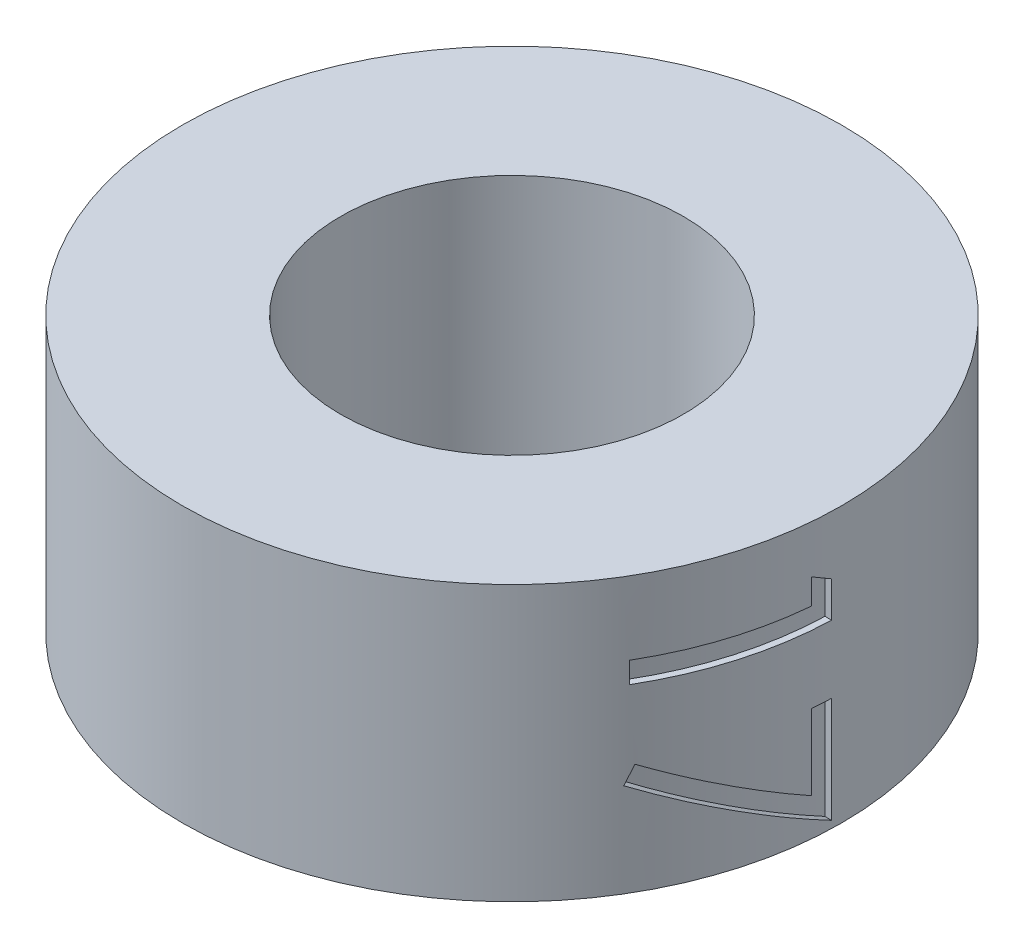
ISO-10303-21;
HEADER;
FILE_DESCRIPTION(('STEP AP214'),'2;1');
FILE_NAME('part.step','',(''),(''),'','','');
FILE_SCHEMA(('AUTOMOTIVE_DESIGN { 1 0 10303 214 1 1 1 1 }'));
ENDSEC;
DATA;
#1=APPLICATION_CONTEXT('core data for automotive mechanical design processes');
#2=APPLICATION_PROTOCOL_DEFINITION('international standard','automotive_design',2000,#1);
#3=PRODUCT_CONTEXT('',#1,'mechanical');
#4=PRODUCT('Part','Part','',(#3));
#5=PRODUCT_RELATED_PRODUCT_CATEGORY('part','',(#4));
#6=PRODUCT_DEFINITION_FORMATION('','',#4);
#7=PRODUCT_DEFINITION_CONTEXT('part definition',#1,'design');
#8=PRODUCT_DEFINITION('design','',#6,#7);
#9=PRODUCT_DEFINITION_SHAPE('','',#8);
#10=(LENGTH_UNIT() NAMED_UNIT(*) SI_UNIT(.MILLI.,.METRE.));
#11=(NAMED_UNIT(*) PLANE_ANGLE_UNIT() SI_UNIT($,.RADIAN.));
#12=(NAMED_UNIT(*) SI_UNIT($,.STERADIAN.) SOLID_ANGLE_UNIT());
#13=UNCERTAINTY_MEASURE_WITH_UNIT(LENGTH_MEASURE(1.E-05),#10,'distance_accuracy_value','');
#14=(GEOMETRIC_REPRESENTATION_CONTEXT(3) GLOBAL_UNCERTAINTY_ASSIGNED_CONTEXT((#13)) GLOBAL_UNIT_ASSIGNED_CONTEXT((#10,
#11,#12)) REPRESENTATION_CONTEXT('',''));
#15=CARTESIAN_POINT('',(0.,0.,0.));
#16=DIRECTION('',(0.,0.,1.));
#17=DIRECTION('',(1.,0.,0.));
#18=AXIS2_PLACEMENT_3D('',#15,#16,#17);
#19=CARTESIAN_POINT('',(0.,10.583333333164,0.));
#20=DIRECTION('',(0.,1.,0.));
#21=DIRECTION('',(0.,0.,1.));
#22=AXIS2_PLACEMENT_3D('',#19,#20,#21);
#23=PLANE('',#22);
#24=CARTESIAN_POINT('',(0.,10.583333333164,0.));
#25=DIRECTION('',(0.,1.,0.));
#26=DIRECTION('',(0.,0.,1.));
#27=AXIS2_PLACEMENT_3D('',#24,#25,#26);
#28=CIRCLE('',#27,12.7);
#29=CARTESIAN_POINT('',(0.,10.583333333164,12.7));
#30=VERTEX_POINT('',#29);
#31=EDGE_CURVE('E13',#30,#30,#28,.T.);
#32=ORIENTED_EDGE('',*,*,#31,.T.);
#33=EDGE_LOOP('',(#32));
#34=FACE_BOUND('',#33,.T.);
#35=CARTESIAN_POINT('',(0.,10.583333333164,0.));
#36=DIRECTION('',(0.,1.,0.));
#37=DIRECTION('',(0.,0.,1.));
#38=AXIS2_PLACEMENT_3D('',#35,#36,#37);
#39=CIRCLE('',#38,6.604);
#40=CARTESIAN_POINT('',(0.,10.583333333164,6.604));
#41=VERTEX_POINT('',#40);
#42=EDGE_CURVE('E464',#41,#41,#39,.T.);
#43=ORIENTED_EDGE('',*,*,#42,.F.);
#44=EDGE_LOOP('',(#43));
#45=FACE_BOUND('',#44,.T.);
#46=ADVANCED_FACE('F85',(#34,#45),#23,.T.);
#47=CARTESIAN_POINT('',(0.,0.,0.));
#48=DIRECTION('',(0.,1.,0.));
#49=DIRECTION('',(0.,0.,1.));
#50=AXIS2_PLACEMENT_3D('',#47,#48,#49);
#51=PLANE('',#50);
#52=CARTESIAN_POINT('',(0.,0.,0.));
#53=DIRECTION('',(0.,1.,0.));
#54=DIRECTION('',(0.,0.,1.));
#55=AXIS2_PLACEMENT_3D('',#52,#53,#54);
#56=CIRCLE('',#55,12.7);
#57=CARTESIAN_POINT('',(0.,0.,12.7));
#58=VERTEX_POINT('',#57);
#59=EDGE_CURVE('E96',#58,#58,#56,.T.);
#60=ORIENTED_EDGE('',*,*,#59,.F.);
#61=EDGE_LOOP('',(#60));
#62=FACE_BOUND('',#61,.T.);
#63=CARTESIAN_POINT('',(0.,0.,0.));
#64=DIRECTION('',(0.,1.,0.));
#65=DIRECTION('',(0.,0.,1.));
#66=AXIS2_PLACEMENT_3D('',#63,#64,#65);
#67=CIRCLE('',#66,6.604);
#68=CARTESIAN_POINT('',(0.,0.,6.604));
#69=VERTEX_POINT('',#68);
#70=EDGE_CURVE('E284',#69,#69,#67,.T.);
#71=ORIENTED_EDGE('',*,*,#70,.T.);
#72=EDGE_LOOP('',(#71));
#73=FACE_BOUND('',#72,.T.);
#74=ADVANCED_FACE('F635',(#62,#73),#51,.F.);
#75=CARTESIAN_POINT('',(0.,10.583333333164,0.));
#76=DIRECTION('',(0.,-1.,0.));
#77=DIRECTION('',(0.,0.,-1.));
#78=AXIS2_PLACEMENT_3D('',#75,#76,#77);
#79=CYLINDRICAL_SURFACE('',#78,12.7);
#80=DIRECTION('',(0.,-1.,0.));
#81=VECTOR('',#80,1.);
#82=CARTESIAN_POINT('',(12.6940492992841,8.3364375463962,0.388731767860738));
#83=LINE('',#82,#81);
#84=CARTESIAN_POINT('',(12.6940492992841,8.3364375463962,0.388731767860738));
#85=VERTEX_POINT('',#84);
#86=CARTESIAN_POINT('',(12.6940492992841,6.95500725793466,0.388731767860738));
#87=VERTEX_POINT('',#86);
#88=EDGE_CURVE('E233',#85,#87,#83,.T.);
#89=ORIENTED_EDGE('',*,*,#88,.T.);
#90=CARTESIAN_POINT('',(0.,6.95500725793466,0.));
#91=DIRECTION('',(0.,-1.,0.));
#92=DIRECTION('',(0.862496721862146,0.,0.506062649063386));
#93=AXIS2_PLACEMENT_3D('',#90,#91,#92);
#94=CIRCLE('',#93,12.7);
#95=CARTESIAN_POINT('',(10.9537083676493,6.95500725793466,6.426995643105));
#96=VERTEX_POINT('',#95);
#97=EDGE_CURVE('E104',#87,#96,#94,.T.);
#98=ORIENTED_EDGE('',*,*,#97,.T.);
#99=DIRECTION('',(0.,1.,0.));
#100=VECTOR('',#99,1.);
#101=CARTESIAN_POINT('',(10.9537083676493,6.95500725793466,6.426995643105));
#102=LINE('',#101,#100);
#103=CARTESIAN_POINT('',(10.9537083676493,7.76910982203722,6.426995643105));
#104=VERTEX_POINT('',#103);
#105=EDGE_CURVE('E776',#96,#104,#102,.T.);
#106=ORIENTED_EDGE('',*,*,#105,.T.);
#107=CARTESIAN_POINT('',(0.,7.76910982203722,0.));
#108=DIRECTION('',(0.,-1.,0.));
#109=DIRECTION('',(0.862496721862146,0.,0.506062649063386));
#110=AXIS2_PLACEMENT_3D('',#107,#108,#109);
#111=CIRCLE('',#110,12.7);
#112=CARTESIAN_POINT('',(12.6505153123571,7.76910982203722,1.12002782635923));
#113=VERTEX_POINT('',#112);
#114=EDGE_CURVE('E230',#113,#104,#111,.T.);
#115=ORIENTED_EDGE('',*,*,#114,.F.);
#116=DIRECTION('',(0.,1.,0.));
#117=VECTOR('',#116,1.);
#118=CARTESIAN_POINT('',(12.6505153123571,7.76910982203722,1.12002782635923));
#119=LINE('',#118,#117);
#120=CARTESIAN_POINT('',(12.6505153123571,8.7460328989603,1.12002782635923));
#121=VERTEX_POINT('',#120);
#122=EDGE_CURVE('E207',#113,#121,#119,.T.);
#123=ORIENTED_EDGE('',*,*,#122,.T.);
#124=CARTESIAN_POINT('',(12.6940492992841,8.3364375463962,0.388731767860738));
#125=CARTESIAN_POINT('',(12.6865736864328,8.47296936585008,0.632848163593977));
#126=CARTESIAN_POINT('',(12.6720543145813,8.60950107950642,0.876748622898523));
#127=CARTESIAN_POINT('',(12.6505153123571,8.7460328989603,1.12002782635923));
#128=B_SPLINE_CURVE_WITH_KNOTS('',3,(#124,#125,#126,#127),.UNSPECIFIED.,.F.,.F.,(4,4),(0.,1.),.UNSPECIFIED.);
#129=EDGE_CURVE('E186',#121,#85,#128,.F.);
#130=ORIENTED_EDGE('',*,*,#129,.T.);
#131=EDGE_LOOP('',(#89,#98,#106,#115,#123,#130));
#132=FACE_BOUND('',#131,.T.);
#133=CARTESIAN_POINT('',(11.0307933056903,4.27101286690902,6.29377462633824));
#134=CARTESIAN_POINT('',(10.9784712609042,4.05052675530914,6.38547693467176));
#135=CARTESIAN_POINT('',(10.925005634166,3.83004064517556,6.47652675460889));
#136=CARTESIAN_POINT('',(10.8704130509916,3.60955453357568,6.56689577356245));
#137=B_SPLINE_CURVE_WITH_KNOTS('',3,(#133,#134,#135,#136),.UNSPECIFIED.,.F.,.F.,(4,4),(0.,1.),.UNSPECIFIED.);
#138=CARTESIAN_POINT('',(10.8704130509916,3.60955453357568,6.56689577356245));
#139=VERTEX_POINT('',#138);
#140=CARTESIAN_POINT('',(11.0307933056903,4.27101286690902,6.29377462633824));
#141=VERTEX_POINT('',#140);
#142=EDGE_CURVE('E485',#139,#141,#137,.F.);
#143=ORIENTED_EDGE('',*,*,#142,.T.);
#144=CARTESIAN_POINT('',(12.6505153123571,1.44455052716543,1.12002782635923));
#145=CARTESIAN_POINT('',(12.5702104665978,1.91563365191412,2.02705679209195));
#146=CARTESIAN_POINT('',(12.3919891413002,2.38670464041329,2.92536052035138));
#147=CARTESIAN_POINT('',(11.8478960443498,3.32885875366115,4.66331302556584));
#148=CARTESIAN_POINT('',(11.4820504876255,3.79992974216033,5.50287806629863));
#149=CARTESIAN_POINT('',(11.0307933056903,4.27101286690902,6.29377462633824));
#150=B_SPLINE_CURVE_WITH_KNOTS('',3,(#144,#145,#146,#147,#148,#149),.UNSPECIFIED.,.F.,.F.,(4,2,
4),(0.,0.5,1.),.UNSPECIFIED.);
#151=CARTESIAN_POINT('',(12.6505153123571,1.44455052716543,1.12002782635923));
#152=VERTEX_POINT('',#151);
#153=EDGE_CURVE('E380',#141,#152,#150,.F.);
#154=ORIENTED_EDGE('',*,*,#153,.T.);
#155=DIRECTION('',(0.,1.,0.));
#156=VECTOR('',#155,1.);
#157=CARTESIAN_POINT('',(12.6505153123571,1.44455052716543,1.12002782635923));
#158=LINE('',#157,#156);
#159=CARTESIAN_POINT('',(12.6505153123571,4.34987905280645,1.12002782635923));
#160=VERTEX_POINT('',#159);
#161=EDGE_CURVE('E584',#152,#160,#158,.T.);
#162=ORIENTED_EDGE('',*,*,#161,.T.);
#163=CARTESIAN_POINT('',(0.,4.34987905280645,0.));
#164=DIRECTION('',(0.,-1.,0.));
#165=DIRECTION('',(0.996103567902133,0.,0.0881911674298605));
#166=AXIS2_PLACEMENT_3D('',#163,#164,#165);
#167=CIRCLE('',#166,12.7);
#168=CARTESIAN_POINT('',(12.6940492992841,4.34987905280645,0.388731767860738));
#169=VERTEX_POINT('',#168);
#170=EDGE_CURVE('E112',#169,#160,#167,.T.);
#171=ORIENTED_EDGE('',*,*,#170,.F.);
#172=DIRECTION('',(0.,-1.,0.));
#173=VECTOR('',#172,1.);
#174=CARTESIAN_POINT('',(12.6940492992841,4.34987905280645,0.388731767860738));
#175=LINE('',#174,#173);
#176=CARTESIAN_POINT('',(12.6940492992841,0.279366232293632,0.388731767860738));
#177=VERTEX_POINT('',#176);
#178=EDGE_CURVE('E463',#169,#177,#175,.T.);
#179=ORIENTED_EDGE('',*,*,#178,.T.);
#180=CARTESIAN_POINT('',(10.8704130509916,3.60955453357568,6.56689577356245));
#181=CARTESIAN_POINT('',(11.4317008496281,3.05450865741236,5.6377763810749));
#182=CARTESIAN_POINT('',(11.873155937433,2.49949176648167,4.63642247771384));
#183=CARTESIAN_POINT('',(12.4877470905524,1.38942899938765,2.55429401378346));
#184=CARTESIAN_POINT('',(12.6608234943123,0.834412108456952,1.47372157623623));
#185=CARTESIAN_POINT('',(12.6940492992841,0.279366232293632,0.388731767860738));
#186=B_SPLINE_CURVE_WITH_KNOTS('',3,(#180,#181,#182,#183,#184,#185),.UNSPECIFIED.,.F.,.F.,(4,2,
4),(0.,0.5,1.),.UNSPECIFIED.);
#187=EDGE_CURVE('E475',#177,#139,#186,.F.);
#188=ORIENTED_EDGE('',*,*,#187,.T.);
#189=EDGE_LOOP('',(#143,#154,#162,#171,#179,#188));
#190=FACE_BOUND('',#189,.T.);
#191=ORIENTED_EDGE('',*,*,#31,.F.);
#192=EDGE_LOOP('',(#191));
#193=FACE_BOUND('',#192,.T.);
#194=ORIENTED_EDGE('',*,*,#59,.T.);
#195=EDGE_LOOP('',(#194));
#196=FACE_BOUND('',#195,.T.);
#197=ADVANCED_FACE('F87',(#132,#190,#193,#196),#79,.T.);
#198=CARTESIAN_POINT('',(0.,10.583333333164,0.));
#199=DIRECTION('',(0.,-1.,0.));
#200=DIRECTION('',(0.,0.,-1.));
#201=AXIS2_PLACEMENT_3D('',#198,#199,#200);
#202=CYLINDRICAL_SURFACE('',#201,6.604);
#203=ORIENTED_EDGE('',*,*,#42,.T.);
#204=EDGE_LOOP('',(#203));
#205=FACE_BOUND('',#204,.T.);
#206=ORIENTED_EDGE('',*,*,#70,.F.);
#207=EDGE_LOOP('',(#206));
#208=FACE_BOUND('',#207,.T.);
#209=ADVANCED_FACE('F400',(#205,#208),#202,.F.);
#210=CARTESIAN_POINT('',(11.0307933056903,4.27101286690902,6.29377462633824));
#211=CARTESIAN_POINT('',(11.4820504876255,3.79992974216033,5.50287806629863));
#212=CARTESIAN_POINT('',(11.8478960443498,3.32885875366115,4.66331302556584));
#213=CARTESIAN_POINT('',(12.3919891413002,2.38670464041329,2.92536052035138));
#214=CARTESIAN_POINT('',(12.5702104665978,1.91563365191412,2.02705679209195));
#215=CARTESIAN_POINT('',(12.6505153123571,1.44455052716543,1.12002782635923));
#216=CARTESIAN_POINT('',(10.8101774395764,4.27101286690902,6.16789913381148));
#217=CARTESIAN_POINT('',(11.2524094287087,3.79992979453202,5.39282059114042));
#218=CARTESIAN_POINT('',(11.6109381234628,3.32885875366115,4.57004676505452));
#219=CARTESIAN_POINT('',(12.1441493584742,2.38670464041329,2.86685330994435));
#220=CARTESIAN_POINT('',(12.318806266015,1.91563359954242,1.98651555742978));
#221=CARTESIAN_POINT('',(12.3975050061099,1.44455052716543,1.09762726983204));
#222=B_SPLINE_SURFACE_WITH_KNOTS('',1,3,((#210,#211,#212,#213,#214,#215),(#216,#217,#218,#219,
#220,#221)),.UNSPECIFIED.,.F.,.F.,.F.,(2,2),(4,2,4),(0.,1.),(0.,0.5,1.),.UNSPECIFIED.);
#223=CARTESIAN_POINT('',(12.3975050061099,1.44455052716543,1.09762726983204));
#224=CARTESIAN_POINT('',(12.6505153123571,1.44455052716543,1.12002782635923));
#225=B_SPLINE_CURVE_WITH_KNOTS('',1,(#223,#224),.UNSPECIFIED.,.F.,.F.,(2,2),(0.,1.),.UNSPECIFIED.);
#226=CARTESIAN_POINT('',(12.3975050061099,1.44455052716543,1.09762726983204));
#227=VERTEX_POINT('',#226);
#228=EDGE_CURVE('E443',#227,#152,#225,.T.);
#229=CARTESIAN_POINT('',(10.8101774395764,4.27101286690902,6.16789913381148));
#230=CARTESIAN_POINT('',(11.0307933056903,4.27101286690902,6.29377462633824));
#231=B_SPLINE_CURVE_WITH_KNOTS('',1,(#229,#230),.UNSPECIFIED.,.F.,.F.,(2,2),(0.,1.),.UNSPECIFIED.);
#232=CARTESIAN_POINT('',(10.8101774395764,4.27101286690902,6.16789913381148));
#233=VERTEX_POINT('',#232);
#234=EDGE_CURVE('E431',#233,#141,#231,.T.);
#235=CARTESIAN_POINT('',(10.8101774395764,4.27101286690902,6.16789913381148));
#236=CARTESIAN_POINT('',(11.2524094287087,3.79992979453202,5.39282059114042));
#237=CARTESIAN_POINT('',(11.6109381234628,3.32885875366115,4.57004676505452));
#238=CARTESIAN_POINT('',(12.1441493584742,2.38670464041329,2.86685330994435));
#239=CARTESIAN_POINT('',(12.318806266015,1.91563359954242,1.98651555742978));
#240=CARTESIAN_POINT('',(12.3975050061099,1.44455052716543,1.09762726983204));
#241=B_SPLINE_CURVE_WITH_KNOTS('',3,(#235,#236,#237,#238,#239,#240),.UNSPECIFIED.,.F.,.F.,(4,2,
4),(0.,0.5,1.),.UNSPECIFIED.);
#242=EDGE_CURVE('E366',#233,#227,#241,.T.);
#243=ORIENTED_EDGE('',*,*,#228,.T.);
#244=ORIENTED_EDGE('',*,*,#153,.F.);
#245=ORIENTED_EDGE('',*,*,#234,.F.);
#246=ORIENTED_EDGE('',*,*,#242,.T.);
#247=EDGE_LOOP('',(#243,#244,#245,#246));
#248=FACE_BOUND('',#247,.T.);
#249=ADVANCED_FACE('F387',(#248),#222,.T.);
#250=CARTESIAN_POINT('',(10.8704130509916,3.60955453357568,6.56689577356245));
#251=CARTESIAN_POINT('',(10.925005634166,3.83004064517556,6.47652675460889));
#252=CARTESIAN_POINT('',(10.9784712609042,4.05052675530914,6.38547693467176));
#253=CARTESIAN_POINT('',(11.0307933056903,4.27101286690902,6.29377462633824));
#254=CARTESIAN_POINT('',(10.6530047899717,3.60955453357568,6.4355578580912));
#255=CARTESIAN_POINT('',(10.7065055214789,3.8300406451597,6.34699621952308));
#256=CARTESIAN_POINT('',(10.7589018356898,4.050526755325,6.25776739597186));
#257=CARTESIAN_POINT('',(10.8101774395764,4.27101286690902,6.16789913381148));
#258=B_SPLINE_SURFACE_WITH_KNOTS('',1,3,((#250,#251,#252,#253),(#254,#255,#256,#257)),
.UNSPECIFIED.,.F.,.F.,.F.,(2,2),(4,4),(0.,1.),(0.,1.),.UNSPECIFIED.);
#259=CARTESIAN_POINT('',(10.6530047899717,3.60955453357568,6.4355578580912));
#260=CARTESIAN_POINT('',(10.8704130509916,3.60955453357568,6.56689577356245));
#261=B_SPLINE_CURVE_WITH_KNOTS('',1,(#259,#260),.UNSPECIFIED.,.F.,.F.,(2,2),(0.,1.),.UNSPECIFIED.);
#262=CARTESIAN_POINT('',(10.6530047899717,3.60955453357568,6.4355578580912));
#263=VERTEX_POINT('',#262);
#264=EDGE_CURVE('E509',#263,#139,#261,.T.);
#265=CARTESIAN_POINT('',(10.6530047899717,3.60955453357568,6.4355578580912));
#266=CARTESIAN_POINT('',(10.7065055214789,3.8300406451597,6.34699621952308));
#267=CARTESIAN_POINT('',(10.7589018356898,4.050526755325,6.25776739597186));
#268=CARTESIAN_POINT('',(10.8101774395764,4.27101286690902,6.16789913381148));
#269=B_SPLINE_CURVE_WITH_KNOTS('',3,(#265,#266,#267,#268),.UNSPECIFIED.,.F.,.F.,(4,4),(0.,1.),.UNSPECIFIED.);
#270=EDGE_CURVE('E346',#263,#233,#269,.T.);
#271=ORIENTED_EDGE('',*,*,#234,.T.);
#272=ORIENTED_EDGE('',*,*,#142,.F.);
#273=ORIENTED_EDGE('',*,*,#264,.F.);
#274=ORIENTED_EDGE('',*,*,#270,.T.);
#275=EDGE_LOOP('',(#271,#272,#273,#274));
#276=FACE_BOUND('',#275,.T.);
#277=ADVANCED_FACE('F399',(#276),#258,.T.);
#278=CARTESIAN_POINT('',(12.6940492992841,0.279366232293632,0.388731767860738));
#279=CARTESIAN_POINT('',(12.6608234943123,0.834412108456952,1.47372157623623));
#280=CARTESIAN_POINT('',(12.4877470905524,1.38942899938765,2.55429401378346));
#281=CARTESIAN_POINT('',(11.873155937433,2.49949176648167,4.63642247771384));
#282=CARTESIAN_POINT('',(11.4317008496281,3.05450865741236,5.6377763810749));
#283=CARTESIAN_POINT('',(10.8704130509916,3.60955453357568,6.56689577356245));
#284=CARTESIAN_POINT('',(12.4401683132984,0.279366232293632,0.380957132503523));
#285=CARTESIAN_POINT('',(12.4076070316304,0.834411985650508,1.44424690945372));
#286=CARTESIAN_POINT('',(12.2379921487414,1.38942899938765,2.50320813350779));
#287=CARTESIAN_POINT('',(11.6356928186843,2.49949176648167,4.54369402815956));
#288=CARTESIAN_POINT('',(11.2030667109318,3.05450878021881,5.52502105491389));
#289=CARTESIAN_POINT('',(10.6530047899717,3.60955453357568,6.4355578580912));
#290=B_SPLINE_SURFACE_WITH_KNOTS('',1,3,((#278,#279,#280,#281,#282,#283),(#284,#285,#286,#287,
#288,#289)),.UNSPECIFIED.,.F.,.F.,.F.,(2,2),(4,2,4),(0.,1.),(0.,0.5,1.),.UNSPECIFIED.);
#291=CARTESIAN_POINT('',(12.6940492992841,0.279366232293632,0.388731767860738));
#292=CARTESIAN_POINT('',(12.4401683132984,0.279366232293632,0.380957132503523));
#293=B_SPLINE_CURVE_WITH_KNOTS('',1,(#291,#292),.UNSPECIFIED.,.F.,.F.,(2,2),(0.,1.),.UNSPECIFIED.);
#294=CARTESIAN_POINT('',(12.4401683132984,0.279366232293632,0.380957132503523));
#295=VERTEX_POINT('',#294);
#296=EDGE_CURVE('E510',#295,#177,#293,.F.);
#297=CARTESIAN_POINT('',(12.4401683132984,0.279366232293632,0.380957132503523));
#298=CARTESIAN_POINT('',(12.4076070316304,0.834411985650508,1.44424690945372));
#299=CARTESIAN_POINT('',(12.2379921487414,1.38942899938765,2.50320813350779));
#300=CARTESIAN_POINT('',(11.6356928186843,2.49949176648167,4.54369402815956));
#301=CARTESIAN_POINT('',(11.2030667109318,3.05450878021881,5.52502105491389));
#302=CARTESIAN_POINT('',(10.6530047899717,3.60955453357568,6.4355578580912));
#303=B_SPLINE_CURVE_WITH_KNOTS('',3,(#297,#298,#299,#300,#301,#302),.UNSPECIFIED.,.F.,.F.,(4,2,
4),(0.,0.5,1.),.UNSPECIFIED.);
#304=EDGE_CURVE('E570',#295,#263,#303,.T.);
#305=ORIENTED_EDGE('',*,*,#264,.T.);
#306=ORIENTED_EDGE('',*,*,#187,.F.);
#307=ORIENTED_EDGE('',*,*,#296,.F.);
#308=ORIENTED_EDGE('',*,*,#304,.T.);
#309=EDGE_LOOP('',(#305,#306,#307,#308));
#310=FACE_BOUND('',#309,.T.);
#311=ADVANCED_FACE('F524',(#310),#290,.T.);
#312=CARTESIAN_POINT('',(12.6940492992841,2.31462264255004,0.388731767860738));
#313=DIRECTION('',(-0.0306088006189557,0.,0.999531440888514));
#314=DIRECTION('',(0.,-1.,0.));
#315=AXIS2_PLACEMENT_3D('',#312,#313,#314);
#316=PLANE('',#315);
#317=ORIENTED_EDGE('',*,*,#296,.T.);
#318=ORIENTED_EDGE('',*,*,#178,.F.);
#319=DIRECTION('',(0.999531440888514,0.,0.0306088006189557));
#320=VECTOR('',#319,1.);
#321=CARTESIAN_POINT('',(12.6940492992841,4.34987905280645,0.388731767860738));
#322=LINE('',#321,#320);
#323=CARTESIAN_POINT('',(12.4401683132984,4.34987905280645,0.380957132503523));
#324=VERTEX_POINT('',#323);
#325=EDGE_CURVE('E462',#324,#169,#322,.T.);
#326=ORIENTED_EDGE('',*,*,#325,.F.);
#327=DIRECTION('',(0.,-1.,0.));
#328=VECTOR('',#327,1.);
#329=CARTESIAN_POINT('',(12.4401683132984,10.583333333164,0.380957132503523));
#330=LINE('',#329,#328);
#331=EDGE_CURVE('E573',#324,#295,#330,.T.);
#332=ORIENTED_EDGE('',*,*,#331,.T.);
#333=EDGE_LOOP('',(#317,#318,#326,#332));
#334=FACE_BOUND('',#333,.T.);
#335=ADVANCED_FACE('F534',(#334),#316,.T.);
#336=CARTESIAN_POINT('',(0.,4.34987905280645,0.));
#337=DIRECTION('',(0.,1.,0.));
#338=DIRECTION('',(0.,0.,1.));
#339=AXIS2_PLACEMENT_3D('',#336,#337,#338);
#340=PLANE('',#339);
#341=ORIENTED_EDGE('',*,*,#325,.T.);
#342=ORIENTED_EDGE('',*,*,#170,.T.);
#343=DIRECTION('',(0.996103567902133,0.,0.0881911674298605));
#344=VECTOR('',#343,1.);
#345=CARTESIAN_POINT('',(12.6505153123571,4.34987905280645,1.12002782635923));
#346=LINE('',#345,#344);
#347=CARTESIAN_POINT('',(12.3975050061099,4.34987905280645,1.09762726983204));
#348=VERTEX_POINT('',#347);
#349=EDGE_CURVE('E455',#348,#160,#346,.T.);
#350=ORIENTED_EDGE('',*,*,#349,.F.);
#351=CARTESIAN_POINT('',(0.,4.34987905280645,0.));
#352=DIRECTION('',(0.,-1.,0.));
#353=DIRECTION('',(0.,0.,-1.));
#354=AXIS2_PLACEMENT_3D('',#351,#352,#353);
#355=CIRCLE('',#354,12.446);
#356=EDGE_CURVE('E373',#324,#348,#355,.T.);
#357=ORIENTED_EDGE('',*,*,#356,.F.);
#358=EDGE_LOOP('',(#341,#342,#350,#357));
#359=FACE_BOUND('',#358,.T.);
#360=ADVANCED_FACE('F318',(#359),#340,.F.);
#361=CARTESIAN_POINT('',(12.6505153123571,2.89721478998594,1.12002782635923));
#362=DIRECTION('',(0.0881911674298605,0.,-0.996103567902133));
#363=DIRECTION('',(0.,1.,0.));
#364=AXIS2_PLACEMENT_3D('',#361,#362,#363);
#365=PLANE('',#364);
#366=DIRECTION('',(0.,-1.,0.));
#367=VECTOR('',#366,1.);
#368=CARTESIAN_POINT('',(12.3975050061099,10.583333333164,1.09762726983204));
#369=LINE('',#368,#367);
#370=EDGE_CURVE('E369',#227,#348,#369,.F.);
#371=ORIENTED_EDGE('',*,*,#370,.T.);
#372=ORIENTED_EDGE('',*,*,#349,.T.);
#373=ORIENTED_EDGE('',*,*,#161,.F.);
#374=ORIENTED_EDGE('',*,*,#228,.F.);
#375=EDGE_LOOP('',(#371,#372,#373,#374));
#376=FACE_BOUND('',#375,.T.);
#377=ADVANCED_FACE('F316',(#376),#365,.T.);
#378=CARTESIAN_POINT('',(0.,10.583333333164,0.));
#379=DIRECTION('',(0.,-1.,0.));
#380=DIRECTION('',(0.,0.,-1.));
#381=AXIS2_PLACEMENT_3D('',#378,#379,#380);
#382=CYLINDRICAL_SURFACE('',#381,12.446);
#383=ORIENTED_EDGE('',*,*,#356,.T.);
#384=ORIENTED_EDGE('',*,*,#370,.F.);
#385=ORIENTED_EDGE('',*,*,#242,.F.);
#386=ORIENTED_EDGE('',*,*,#270,.F.);
#387=ORIENTED_EDGE('',*,*,#304,.F.);
#388=ORIENTED_EDGE('',*,*,#331,.F.);
#389=EDGE_LOOP('',(#383,#384,#385,#386,#387,#388));
#390=FACE_BOUND('',#389,.T.);
#391=ADVANCED_FACE('F312',(#390),#382,.T.);
#392=CARTESIAN_POINT('',(0.,6.95500725793466,0.));
#393=DIRECTION('',(0.,1.,0.));
#394=DIRECTION('',(0.,0.,1.));
#395=AXIS2_PLACEMENT_3D('',#392,#393,#394);
#396=PLANE('',#395);
#397=DIRECTION('',(-0.999531440888514,0.,-0.0306088006189555));
#398=VECTOR('',#397,1.);
#399=CARTESIAN_POINT('',(12.6940492992841,6.95500725793466,0.388731767860735));
#400=LINE('',#399,#398);
#401=CARTESIAN_POINT('',(12.4401683132984,6.95500725793466,0.380957132503523));
#402=VERTEX_POINT('',#401);
#403=EDGE_CURVE('E282',#87,#402,#400,.T.);
#404=ORIENTED_EDGE('',*,*,#403,.T.);
#405=CARTESIAN_POINT('',(0.,6.95500725793466,0.));
#406=DIRECTION('',(0.,-1.,0.));
#407=DIRECTION('',(0.,0.,-1.));
#408=AXIS2_PLACEMENT_3D('',#405,#406,#407);
#409=CIRCLE('',#408,12.446);
#410=CARTESIAN_POINT('',(10.7346342002963,6.95500725793466,6.2984557302429));
#411=VERTEX_POINT('',#410);
#412=EDGE_CURVE('E225',#402,#411,#409,.T.);
#413=ORIENTED_EDGE('',*,*,#412,.T.);
#414=DIRECTION('',(-0.862496721862146,0.,-0.506062649063386));
#415=VECTOR('',#414,1.);
#416=CARTESIAN_POINT('',(10.9537083676493,6.95500725793466,6.426995643105));
#417=LINE('',#416,#415);
#418=EDGE_CURVE('E280',#96,#411,#417,.T.);
#419=ORIENTED_EDGE('',*,*,#418,.F.);
#420=ORIENTED_EDGE('',*,*,#97,.F.);
#421=EDGE_LOOP('',(#404,#413,#419,#420));
#422=FACE_BOUND('',#421,.T.);
#423=ADVANCED_FACE('F310',(#422),#396,.T.);
#424=CARTESIAN_POINT('',(10.9537083676493,7.36205853998594,6.426995643105));
#425=DIRECTION('',(0.506062649063386,0.,-0.862496721862146));
#426=DIRECTION('',(0.,1.,0.));
#427=AXIS2_PLACEMENT_3D('',#424,#425,#426);
#428=PLANE('',#427);
#429=ORIENTED_EDGE('',*,*,#418,.T.);
#430=DIRECTION('',(0.,-1.,0.));
#431=VECTOR('',#430,1.);
#432=CARTESIAN_POINT('',(10.7346342002963,10.583333333164,6.2984557302429));
#433=LINE('',#432,#431);
#434=CARTESIAN_POINT('',(10.7346342002963,7.76910982203722,6.2984557302429));
#435=VERTEX_POINT('',#434);
#436=EDGE_CURVE('E218',#411,#435,#433,.F.);
#437=ORIENTED_EDGE('',*,*,#436,.T.);
#438=DIRECTION('',(-0.862496721862146,0.,-0.506062649063386));
#439=VECTOR('',#438,1.);
#440=CARTESIAN_POINT('',(10.9537083676493,7.76910982203722,6.426995643105));
#441=LINE('',#440,#439);
#442=EDGE_CURVE('E278',#104,#435,#441,.T.);
#443=ORIENTED_EDGE('',*,*,#442,.F.);
#444=ORIENTED_EDGE('',*,*,#105,.F.);
#445=EDGE_LOOP('',(#429,#437,#443,#444));
#446=FACE_BOUND('',#445,.T.);
#447=ADVANCED_FACE('F714',(#446),#428,.T.);
#448=CARTESIAN_POINT('',(0.,7.76910982203722,0.));
#449=DIRECTION('',(0.,1.,0.));
#450=DIRECTION('',(0.,0.,1.));
#451=AXIS2_PLACEMENT_3D('',#448,#449,#450);
#452=PLANE('',#451);
#453=ORIENTED_EDGE('',*,*,#442,.T.);
#454=CARTESIAN_POINT('',(0.,7.76910982203722,0.));
#455=DIRECTION('',(0.,-1.,0.));
#456=DIRECTION('',(0.,0.,-1.));
#457=AXIS2_PLACEMENT_3D('',#454,#455,#456);
#458=CIRCLE('',#457,12.446);
#459=CARTESIAN_POINT('',(12.3975050061099,7.76910982203722,1.09762726983204));
#460=VERTEX_POINT('',#459);
#461=EDGE_CURVE('E214',#460,#435,#458,.T.);
#462=ORIENTED_EDGE('',*,*,#461,.F.);
#463=DIRECTION('',(-0.996103567902133,0.,-0.0881911674298605));
#464=VECTOR('',#463,1.);
#465=CARTESIAN_POINT('',(12.6505153123571,7.76910982203722,1.12002782635923));
#466=LINE('',#465,#464);
#467=EDGE_CURVE('E193',#113,#460,#466,.T.);
#468=ORIENTED_EDGE('',*,*,#467,.F.);
#469=ORIENTED_EDGE('',*,*,#114,.T.);
#470=EDGE_LOOP('',(#453,#462,#468,#469));
#471=FACE_BOUND('',#470,.T.);
#472=ADVANCED_FACE('F721',(#471),#452,.F.);
#473=CARTESIAN_POINT('',(12.6505153123571,8.25757136049876,1.12002782635923));
#474=DIRECTION('',(0.0881911674298605,0.,-0.996103567902133));
#475=DIRECTION('',(0.,1.,0.));
#476=AXIS2_PLACEMENT_3D('',#473,#474,#475);
#477=PLANE('',#476);
#478=ORIENTED_EDGE('',*,*,#467,.T.);
#479=DIRECTION('',(0.,-1.,0.));
#480=VECTOR('',#479,1.);
#481=CARTESIAN_POINT('',(12.3975050061099,10.583333333164,1.09762726983204));
#482=LINE('',#481,#480);
#483=CARTESIAN_POINT('',(12.3975050061099,8.7460328989603,1.09762726983204));
#484=VERTEX_POINT('',#483);
#485=EDGE_CURVE('E202',#460,#484,#482,.F.);
#486=ORIENTED_EDGE('',*,*,#485,.T.);
#487=CARTESIAN_POINT('',(12.6505153123571,8.7460328989603,1.12002782635923));
#488=CARTESIAN_POINT('',(12.3975050061099,8.7460328989603,1.09762726983204));
#489=B_SPLINE_CURVE_WITH_KNOTS('',1,(#487,#488),.UNSPECIFIED.,.F.,.F.,(2,2),(0.,1.),.UNSPECIFIED.);
#490=EDGE_CURVE('E178',#121,#484,#489,.T.);
#491=ORIENTED_EDGE('',*,*,#490,.F.);
#492=ORIENTED_EDGE('',*,*,#122,.F.);
#493=EDGE_LOOP('',(#478,#486,#491,#492));
#494=FACE_BOUND('',#493,.T.);
#495=ADVANCED_FACE('F211',(#494),#477,.T.);
#496=CARTESIAN_POINT('',(12.6505153123571,8.7460328989603,1.12002782635923));
#497=CARTESIAN_POINT('',(12.6720543145813,8.60950107950642,0.876748622898523));
#498=CARTESIAN_POINT('',(12.6865736864328,8.47296936585008,0.632848163593977));
#499=CARTESIAN_POINT('',(12.6940492992841,8.3364375463962,0.388731767860738));
#500=CARTESIAN_POINT('',(12.3975050061099,8.7460328989603,1.09762726983204));
#501=CARTESIAN_POINT('',(12.4186132282369,8.60950107984798,0.859213651036994));
#502=CARTESIAN_POINT('',(12.4328422127225,8.47296936550852,0.620191199723603));
#503=CARTESIAN_POINT('',(12.4401683132984,8.3364375463962,0.380957132503523));
#504=B_SPLINE_SURFACE_WITH_KNOTS('',1,3,((#496,#497,#498,#499),(#500,#501,#502,#503)),
.UNSPECIFIED.,.F.,.F.,.F.,(2,2),(4,4),(0.,1.),(0.,1.),.UNSPECIFIED.);
#505=CARTESIAN_POINT('',(12.3975050061099,8.7460328989603,1.09762726983204));
#506=CARTESIAN_POINT('',(12.4186132282369,8.60950107984798,0.859213651036994));
#507=CARTESIAN_POINT('',(12.4328422127225,8.47296936550852,0.620191199723603));
#508=CARTESIAN_POINT('',(12.4401683132984,8.3364375463962,0.380957132503523));
#509=B_SPLINE_CURVE_WITH_KNOTS('',3,(#505,#506,#507,#508),.UNSPECIFIED.,.F.,.F.,(4,4),(0.,1.),.UNSPECIFIED.);
#510=CARTESIAN_POINT('',(12.4401683132984,8.3364375463962,0.380957132503523));
#511=VERTEX_POINT('',#510);
#512=EDGE_CURVE('E182',#484,#511,#509,.T.);
#513=CARTESIAN_POINT('',(12.4401683132984,8.3364375463962,0.380957132503523));
#514=CARTESIAN_POINT('',(12.6940492992841,8.3364375463962,0.388731767860738));
#515=B_SPLINE_CURVE_WITH_KNOTS('',1,(#513,#514),.UNSPECIFIED.,.F.,.F.,(2,2),(0.,1.),.UNSPECIFIED.);
#516=EDGE_CURVE('E194',#85,#511,#515,.F.);
#517=ORIENTED_EDGE('',*,*,#490,.T.);
#518=ORIENTED_EDGE('',*,*,#512,.T.);
#519=ORIENTED_EDGE('',*,*,#516,.F.);
#520=ORIENTED_EDGE('',*,*,#129,.F.);
#521=EDGE_LOOP('',(#517,#518,#519,#520));
#522=FACE_BOUND('',#521,.T.);
#523=ADVANCED_FACE('F181',(#522),#504,.T.);
#524=CARTESIAN_POINT('',(12.6940492992841,7.64572240216543,0.388731767860738));
#525=DIRECTION('',(-0.0306088006189557,0.,0.999531440888514));
#526=DIRECTION('',(0.,-1.,0.));
#527=AXIS2_PLACEMENT_3D('',#524,#525,#526);
#528=PLANE('',#527);
#529=ORIENTED_EDGE('',*,*,#88,.F.);
#530=ORIENTED_EDGE('',*,*,#516,.T.);
#531=DIRECTION('',(0.,-1.,0.));
#532=VECTOR('',#531,1.);
#533=CARTESIAN_POINT('',(12.4401683132984,10.583333333164,0.380957132503523));
#534=LINE('',#533,#532);
#535=EDGE_CURVE('E205',#511,#402,#534,.T.);
#536=ORIENTED_EDGE('',*,*,#535,.T.);
#537=ORIENTED_EDGE('',*,*,#403,.F.);
#538=EDGE_LOOP('',(#529,#530,#536,#537));
#539=FACE_BOUND('',#538,.T.);
#540=ADVANCED_FACE('F254',(#539),#528,.T.);
#541=CARTESIAN_POINT('',(0.,10.583333333164,0.));
#542=DIRECTION('',(0.,-1.,0.));
#543=DIRECTION('',(0.,0.,-1.));
#544=AXIS2_PLACEMENT_3D('',#541,#542,#543);
#545=CYLINDRICAL_SURFACE('',#544,12.446);
#546=ORIENTED_EDGE('',*,*,#512,.F.);
#547=ORIENTED_EDGE('',*,*,#485,.F.);
#548=ORIENTED_EDGE('',*,*,#461,.T.);
#549=ORIENTED_EDGE('',*,*,#436,.F.);
#550=ORIENTED_EDGE('',*,*,#412,.F.);
#551=ORIENTED_EDGE('',*,*,#535,.F.);
#552=EDGE_LOOP('',(#546,#547,#548,#549,#550,#551));
#553=FACE_BOUND('',#552,.T.);
#554=ADVANCED_FACE('F200',(#553),#545,.T.);
#555=CLOSED_SHELL('',(#46,#74,#197,#209,#249,#277,#311,#335,#360,#377,#391,#423,#447,#472,#495,
#523,#540,#554));
#556=MANIFOLD_SOLID_BREP('B2',#555);
#557=ADVANCED_BREP_SHAPE_REPRESENTATION('',(#18,#556),#14);
#558=SHAPE_DEFINITION_REPRESENTATION(#9,#557);
ENDSEC;
END-ISO-10303-21;
